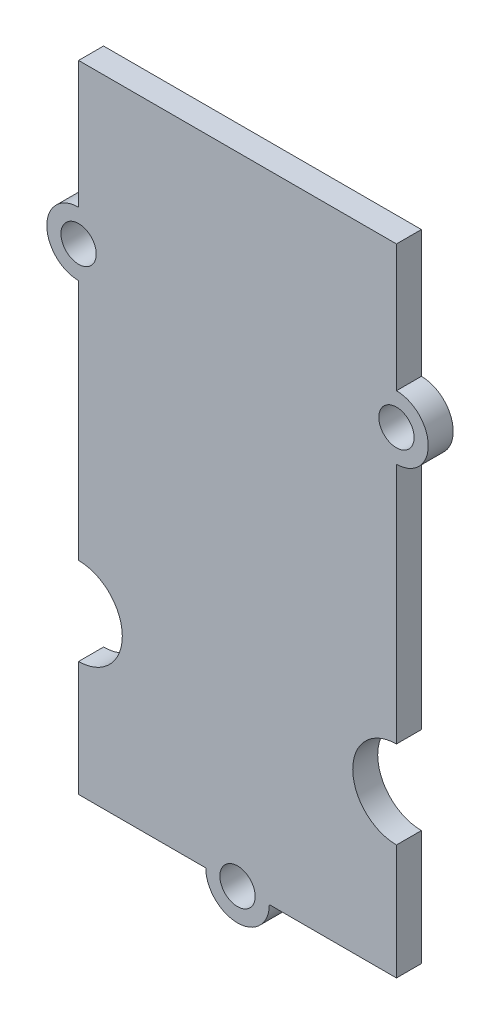
ISO-10303-21;
HEADER;
FILE_DESCRIPTION(('STEP AP214'),'2;1');
FILE_NAME('part.step','',(''),(''),'','','');
FILE_SCHEMA(('AUTOMOTIVE_DESIGN { 1 0 10303 214 1 1 1 1 }'));
ENDSEC;
DATA;
#1=APPLICATION_CONTEXT('core data for automotive mechanical design processes');
#2=APPLICATION_PROTOCOL_DEFINITION('international standard','automotive_design',2000,#1);
#3=PRODUCT_CONTEXT('',#1,'mechanical');
#4=PRODUCT('Part','Part','',(#3));
#5=PRODUCT_RELATED_PRODUCT_CATEGORY('part','',(#4));
#6=PRODUCT_DEFINITION_FORMATION('','',#4);
#7=PRODUCT_DEFINITION_CONTEXT('part definition',#1,'design');
#8=PRODUCT_DEFINITION('design','',#6,#7);
#9=PRODUCT_DEFINITION_SHAPE('','',#8);
#10=(LENGTH_UNIT() NAMED_UNIT(*) SI_UNIT(.MILLI.,.METRE.));
#11=(NAMED_UNIT(*) PLANE_ANGLE_UNIT() SI_UNIT($,.RADIAN.));
#12=(NAMED_UNIT(*) SI_UNIT($,.STERADIAN.) SOLID_ANGLE_UNIT());
#13=UNCERTAINTY_MEASURE_WITH_UNIT(LENGTH_MEASURE(1.E-05),#10,'distance_accuracy_value','');
#14=(GEOMETRIC_REPRESENTATION_CONTEXT(3) GLOBAL_UNCERTAINTY_ASSIGNED_CONTEXT((#13)) GLOBAL_UNIT_ASSIGNED_CONTEXT((#10,
#11,#12)) REPRESENTATION_CONTEXT('',''));
#15=CARTESIAN_POINT('',(0.,0.,0.));
#16=DIRECTION('',(0.,0.,1.));
#17=DIRECTION('',(1.,0.,0.));
#18=AXIS2_PLACEMENT_3D('',#15,#16,#17);
#19=CARTESIAN_POINT('',(0.,0.,0.));
#20=DIRECTION('',(0.,0.,1.));
#21=DIRECTION('',(1.,0.,0.));
#22=AXIS2_PLACEMENT_3D('',#19,#20,#21);
#23=PLANE('',#22);
#24=CARTESIAN_POINT('',(0.,30.,0.));
#25=DIRECTION('',(0.,0.,1.));
#26=DIRECTION('',(1.,0.,0.));
#27=AXIS2_PLACEMENT_3D('',#24,#25,#26);
#28=CIRCLE('',#27,1.11);
#29=CARTESIAN_POINT('',(1.11,30.,0.));
#30=VERTEX_POINT('',#29);
#31=EDGE_CURVE('E207',#30,#30,#28,.F.);
#32=ORIENTED_EDGE('',*,*,#31,.F.);
#33=EDGE_LOOP('',(#32));
#34=FACE_BOUND('',#33,.T.);
#35=CARTESIAN_POINT('',(10.,0.,0.));
#36=DIRECTION('',(0.,0.,1.));
#37=DIRECTION('',(1.,0.,0.));
#38=AXIS2_PLACEMENT_3D('',#35,#36,#37);
#39=CIRCLE('',#38,1.11);
#40=CARTESIAN_POINT('',(11.11,0.,0.));
#41=VERTEX_POINT('',#40);
#42=EDGE_CURVE('E298',#41,#41,#39,.F.);
#43=ORIENTED_EDGE('',*,*,#42,.F.);
#44=EDGE_LOOP('',(#43));
#45=FACE_BOUND('',#44,.T.);
#46=CARTESIAN_POINT('',(20.,30.,0.));
#47=DIRECTION('',(0.,0.,1.));
#48=DIRECTION('',(1.,0.,0.));
#49=AXIS2_PLACEMENT_3D('',#46,#47,#48);
#50=CIRCLE('',#49,1.11);
#51=CARTESIAN_POINT('',(21.11,30.,0.));
#52=VERTEX_POINT('',#51);
#53=EDGE_CURVE('E294',#52,#52,#50,.T.);
#54=ORIENTED_EDGE('',*,*,#53,.T.);
#55=EDGE_LOOP('',(#54));
#56=FACE_BOUND('',#55,.T.);
#57=CARTESIAN_POINT('',(20.,30.,0.));
#58=DIRECTION('',(0.,0.,1.));
#59=DIRECTION('',(1.,0.,0.));
#60=AXIS2_PLACEMENT_3D('',#57,#58,#59);
#61=CIRCLE('',#60,2.);
#62=CARTESIAN_POINT('',(20.,28.,0.));
#63=VERTEX_POINT('',#62);
#64=CARTESIAN_POINT('',(20.,32.,0.));
#65=VERTEX_POINT('',#64);
#66=EDGE_CURVE('E191',#63,#65,#61,.T.);
#67=ORIENTED_EDGE('',*,*,#66,.F.);
#68=DIRECTION('',(0.,1.,0.));
#69=VECTOR('',#68,1.);
#70=CARTESIAN_POINT('',(20.,0.,0.));
#71=LINE('',#70,#69);
#72=CARTESIAN_POINT('',(20.,12.75,0.));
#73=VERTEX_POINT('',#72);
#74=EDGE_CURVE('E260',#73,#63,#71,.T.);
#75=ORIENTED_EDGE('',*,*,#74,.F.);
#76=CARTESIAN_POINT('',(20.,10.,0.));
#77=DIRECTION('',(0.,0.,1.));
#78=DIRECTION('',(1.,0.,0.));
#79=AXIS2_PLACEMENT_3D('',#76,#77,#78);
#80=CIRCLE('',#79,2.75);
#81=CARTESIAN_POINT('',(20.,7.25,0.));
#82=VERTEX_POINT('',#81);
#83=EDGE_CURVE('E290',#73,#82,#80,.T.);
#84=ORIENTED_EDGE('',*,*,#83,.T.);
#85=CARTESIAN_POINT('',(20.,0.,0.));
#86=VERTEX_POINT('',#85);
#87=EDGE_CURVE('E261',#86,#82,#71,.T.);
#88=ORIENTED_EDGE('',*,*,#87,.F.);
#89=DIRECTION('',(1.,0.,0.));
#90=VECTOR('',#89,1.);
#91=CARTESIAN_POINT('',(0.,0.,0.));
#92=LINE('',#91,#90);
#93=CARTESIAN_POINT('',(12.,0.,0.));
#94=VERTEX_POINT('',#93);
#95=EDGE_CURVE('E287',#94,#86,#92,.T.);
#96=ORIENTED_EDGE('',*,*,#95,.F.);
#97=CARTESIAN_POINT('',(10.,0.,0.));
#98=DIRECTION('',(0.,0.,1.));
#99=DIRECTION('',(1.,0.,0.));
#100=AXIS2_PLACEMENT_3D('',#97,#98,#99);
#101=CIRCLE('',#100,2.);
#102=CARTESIAN_POINT('',(8.,0.,0.));
#103=VERTEX_POINT('',#102);
#104=EDGE_CURVE('E283',#94,#103,#101,.F.);
#105=ORIENTED_EDGE('',*,*,#104,.T.);
#106=DIRECTION('',(1.,0.,0.));
#107=VECTOR('',#106,1.);
#108=CARTESIAN_POINT('',(0.,0.,0.));
#109=LINE('',#108,#107);
#110=CARTESIAN_POINT('',(0.,0.,0.));
#111=VERTEX_POINT('',#110);
#112=EDGE_CURVE('E279',#111,#103,#109,.T.);
#113=ORIENTED_EDGE('',*,*,#112,.F.);
#114=DIRECTION('',(0.,1.,0.));
#115=VECTOR('',#114,1.);
#116=CARTESIAN_POINT('',(0.,0.,0.));
#117=LINE('',#116,#115);
#118=CARTESIAN_POINT('',(0.,7.25,0.));
#119=VERTEX_POINT('',#118);
#120=EDGE_CURVE('E270',#111,#119,#117,.T.);
#121=ORIENTED_EDGE('',*,*,#120,.T.);
#122=CARTESIAN_POINT('',(0.,10.,0.));
#123=DIRECTION('',(0.,0.,1.));
#124=DIRECTION('',(1.,0.,0.));
#125=AXIS2_PLACEMENT_3D('',#122,#123,#124);
#126=CIRCLE('',#125,2.75);
#127=CARTESIAN_POINT('',(0.,12.75,0.));
#128=VERTEX_POINT('',#127);
#129=EDGE_CURVE('E275',#128,#119,#126,.F.);
#130=ORIENTED_EDGE('',*,*,#129,.F.);
#131=CARTESIAN_POINT('',(0.,28.,0.));
#132=VERTEX_POINT('',#131);
#133=EDGE_CURVE('E271',#128,#132,#117,.T.);
#134=ORIENTED_EDGE('',*,*,#133,.T.);
#135=CARTESIAN_POINT('',(0.,30.,0.));
#136=DIRECTION('',(0.,0.,1.));
#137=DIRECTION('',(1.,0.,0.));
#138=AXIS2_PLACEMENT_3D('',#135,#136,#137);
#139=CIRCLE('',#138,2.);
#140=CARTESIAN_POINT('',(0.,32.,0.));
#141=VERTEX_POINT('',#140);
#142=EDGE_CURVE('E269',#132,#141,#139,.F.);
#143=ORIENTED_EDGE('',*,*,#142,.T.);
#144=CARTESIAN_POINT('',(0.,40.,0.));
#145=VERTEX_POINT('',#144);
#146=EDGE_CURVE('E265',#141,#145,#117,.T.);
#147=ORIENTED_EDGE('',*,*,#146,.T.);
#148=DIRECTION('',(1.,0.,0.));
#149=VECTOR('',#148,1.);
#150=CARTESIAN_POINT('',(0.,40.,0.));
#151=LINE('',#150,#149);
#152=CARTESIAN_POINT('',(20.,40.,0.));
#153=VERTEX_POINT('',#152);
#154=EDGE_CURVE('E259',#145,#153,#151,.T.);
#155=ORIENTED_EDGE('',*,*,#154,.T.);
#156=EDGE_CURVE('E196',#65,#153,#71,.T.);
#157=ORIENTED_EDGE('',*,*,#156,.F.);
#158=EDGE_LOOP('',(#67,#75,#84,#88,#96,#105,#113,#121,#130,#134,#143,#147,#155,#157));
#159=FACE_BOUND('',#158,.T.);
#160=DIRECTION('',(0.,1.,0.));
#161=VECTOR('',#160,1.);
#162=CARTESIAN_POINT('',(7.97952753923228,7.97952753923228,0.));
#163=LINE('',#162,#161);
#164=CARTESIAN_POINT('',(7.97952753923228,7.97952753923228,0.));
#165=VERTEX_POINT('',#164);
#166=CARTESIAN_POINT('',(7.97952753923228,12.0204724607677,0.));
#167=VERTEX_POINT('',#166);
#168=EDGE_CURVE('E189',#165,#167,#163,.T.);
#169=ORIENTED_EDGE('',*,*,#168,.F.);
#170=DIRECTION('',(-1.,0.,0.));
#171=VECTOR('',#170,1.);
#172=CARTESIAN_POINT('',(12.0204724607677,7.97952753923228,0.));
#173=LINE('',#172,#171);
#174=CARTESIAN_POINT('',(12.0204724607677,7.97952753923228,0.));
#175=VERTEX_POINT('',#174);
#176=EDGE_CURVE('E186',#175,#165,#173,.T.);
#177=ORIENTED_EDGE('',*,*,#176,.F.);
#178=DIRECTION('',(0.,-1.,0.));
#179=VECTOR('',#178,1.);
#180=CARTESIAN_POINT('',(12.0204724607677,7.97952753923228,0.));
#181=LINE('',#180,#179);
#182=CARTESIAN_POINT('',(12.0204724607677,12.0204724607677,0.));
#183=VERTEX_POINT('',#182);
#184=EDGE_CURVE('E62',#183,#175,#181,.T.);
#185=ORIENTED_EDGE('',*,*,#184,.F.);
#186=DIRECTION('',(1.,0.,0.));
#187=VECTOR('',#186,1.);
#188=CARTESIAN_POINT('',(12.0204724607677,12.0204724607677,0.));
#189=LINE('',#188,#187);
#190=EDGE_CURVE('E57',#167,#183,#189,.T.);
#191=ORIENTED_EDGE('',*,*,#190,.F.);
#192=EDGE_LOOP('',(#169,#177,#185,#191));
#193=FACE_BOUND('',#192,.T.);
#194=ADVANCED_FACE('F41',(#34,#45,#56,#159,#193),#23,.F.);
#195=CARTESIAN_POINT('',(20.,30.,1.57));
#196=DIRECTION('',(0.,0.,-1.));
#197=DIRECTION('',(-1.,0.,0.));
#198=AXIS2_PLACEMENT_3D('',#195,#196,#197);
#199=CYLINDRICAL_SURFACE('',#198,2.);
#200=ORIENTED_EDGE('',*,*,#66,.T.);
#201=DIRECTION('',(0.,0.,-1.));
#202=VECTOR('',#201,1.);
#203=CARTESIAN_POINT('',(20.,32.,1.57));
#204=LINE('',#203,#202);
#205=CARTESIAN_POINT('',(20.,32.,1.57));
#206=VERTEX_POINT('',#205);
#207=EDGE_CURVE('E11',#206,#65,#204,.T.);
#208=ORIENTED_EDGE('',*,*,#207,.F.);
#209=CARTESIAN_POINT('',(20.,30.,1.57));
#210=DIRECTION('',(0.,0.,1.));
#211=DIRECTION('',(1.,0.,0.));
#212=AXIS2_PLACEMENT_3D('',#209,#210,#211);
#213=CIRCLE('',#212,2.);
#214=CARTESIAN_POINT('',(20.,28.,1.57));
#215=VERTEX_POINT('',#214);
#216=EDGE_CURVE('E202',#215,#206,#213,.T.);
#217=ORIENTED_EDGE('',*,*,#216,.F.);
#218=DIRECTION('',(0.,0.,-1.));
#219=VECTOR('',#218,1.);
#220=CARTESIAN_POINT('',(20.,28.,1.57));
#221=LINE('',#220,#219);
#222=EDGE_CURVE('E254',#215,#63,#221,.T.);
#223=ORIENTED_EDGE('',*,*,#222,.T.);
#224=EDGE_LOOP('',(#200,#208,#217,#223));
#225=FACE_BOUND('',#224,.T.);
#226=ADVANCED_FACE('F43',(#225),#199,.T.);
#227=CARTESIAN_POINT('',(20.,0.,1.57));
#228=DIRECTION('',(-1.,0.,0.));
#229=DIRECTION('',(0.,0.,1.));
#230=AXIS2_PLACEMENT_3D('',#227,#228,#229);
#231=PLANE('',#230);
#232=ORIENTED_EDGE('',*,*,#156,.T.);
#233=DIRECTION('',(0.,0.,-1.));
#234=VECTOR('',#233,1.);
#235=CARTESIAN_POINT('',(20.,40.,1.57));
#236=LINE('',#235,#234);
#237=CARTESIAN_POINT('',(20.,40.,1.57));
#238=VERTEX_POINT('',#237);
#239=EDGE_CURVE('E50',#238,#153,#236,.T.);
#240=ORIENTED_EDGE('',*,*,#239,.F.);
#241=DIRECTION('',(0.,1.,0.));
#242=VECTOR('',#241,1.);
#243=CARTESIAN_POINT('',(20.,0.,1.57));
#244=LINE('',#243,#242);
#245=EDGE_CURVE('E206',#206,#238,#244,.T.);
#246=ORIENTED_EDGE('',*,*,#245,.F.);
#247=ORIENTED_EDGE('',*,*,#207,.T.);
#248=EDGE_LOOP('',(#232,#240,#246,#247));
#249=FACE_BOUND('',#248,.T.);
#250=ADVANCED_FACE('F348',(#249),#231,.F.);
#251=CARTESIAN_POINT('',(0.,40.,1.57));
#252=DIRECTION('',(0.,1.,0.));
#253=DIRECTION('',(0.,0.,1.));
#254=AXIS2_PLACEMENT_3D('',#251,#252,#253);
#255=PLANE('',#254);
#256=ORIENTED_EDGE('',*,*,#154,.F.);
#257=DIRECTION('',(0.,0.,-1.));
#258=VECTOR('',#257,1.);
#259=CARTESIAN_POINT('',(0.,40.,1.57));
#260=LINE('',#259,#258);
#261=CARTESIAN_POINT('',(0.,40.,1.57));
#262=VERTEX_POINT('',#261);
#263=EDGE_CURVE('E339',#262,#145,#260,.T.);
#264=ORIENTED_EDGE('',*,*,#263,.F.);
#265=DIRECTION('',(1.,0.,0.));
#266=VECTOR('',#265,1.);
#267=CARTESIAN_POINT('',(0.,40.,1.57));
#268=LINE('',#267,#266);
#269=EDGE_CURVE('E210',#262,#238,#268,.T.);
#270=ORIENTED_EDGE('',*,*,#269,.T.);
#271=ORIENTED_EDGE('',*,*,#239,.T.);
#272=EDGE_LOOP('',(#256,#264,#270,#271));
#273=FACE_BOUND('',#272,.T.);
#274=ADVANCED_FACE('F345',(#273),#255,.T.);
#275=CARTESIAN_POINT('',(0.,0.,1.57));
#276=DIRECTION('',(-1.,0.,0.));
#277=DIRECTION('',(0.,0.,1.));
#278=AXIS2_PLACEMENT_3D('',#275,#276,#277);
#279=PLANE('',#278);
#280=ORIENTED_EDGE('',*,*,#146,.F.);
#281=DIRECTION('',(0.,0.,-1.));
#282=VECTOR('',#281,1.);
#283=CARTESIAN_POINT('',(0.,32.,1.57));
#284=LINE('',#283,#282);
#285=CARTESIAN_POINT('',(0.,32.,1.57));
#286=VERTEX_POINT('',#285);
#287=EDGE_CURVE('E336',#286,#141,#284,.T.);
#288=ORIENTED_EDGE('',*,*,#287,.F.);
#289=DIRECTION('',(0.,1.,0.));
#290=VECTOR('',#289,1.);
#291=CARTESIAN_POINT('',(0.,0.,1.57));
#292=LINE('',#291,#290);
#293=EDGE_CURVE('E216',#286,#262,#292,.T.);
#294=ORIENTED_EDGE('',*,*,#293,.T.);
#295=ORIENTED_EDGE('',*,*,#263,.T.);
#296=EDGE_LOOP('',(#280,#288,#294,#295));
#297=FACE_BOUND('',#296,.T.);
#298=ADVANCED_FACE('F356',(#297),#279,.T.);
#299=CARTESIAN_POINT('',(0.,30.,1.57));
#300=DIRECTION('',(0.,0.,-1.));
#301=DIRECTION('',(-1.,0.,0.));
#302=AXIS2_PLACEMENT_3D('',#299,#300,#301);
#303=CYLINDRICAL_SURFACE('',#302,2.);
#304=ORIENTED_EDGE('',*,*,#142,.F.);
#305=DIRECTION('',(0.,0.,-1.));
#306=VECTOR('',#305,1.);
#307=CARTESIAN_POINT('',(0.,28.,1.57));
#308=LINE('',#307,#306);
#309=CARTESIAN_POINT('',(0.,28.,1.57));
#310=VERTEX_POINT('',#309);
#311=EDGE_CURVE('E333',#310,#132,#308,.T.);
#312=ORIENTED_EDGE('',*,*,#311,.F.);
#313=CARTESIAN_POINT('',(0.,30.,1.57));
#314=DIRECTION('',(0.,0.,1.));
#315=DIRECTION('',(1.,0.,0.));
#316=AXIS2_PLACEMENT_3D('',#313,#314,#315);
#317=CIRCLE('',#316,2.);
#318=EDGE_CURVE('E220',#310,#286,#317,.F.);
#319=ORIENTED_EDGE('',*,*,#318,.T.);
#320=ORIENTED_EDGE('',*,*,#287,.T.);
#321=EDGE_LOOP('',(#304,#312,#319,#320));
#322=FACE_BOUND('',#321,.T.);
#323=ADVANCED_FACE('F393',(#322),#303,.T.);
#324=ORIENTED_EDGE('',*,*,#133,.F.);
#325=DIRECTION('',(0.,0.,-1.));
#326=VECTOR('',#325,1.);
#327=CARTESIAN_POINT('',(0.,12.75,1.57));
#328=LINE('',#327,#326);
#329=CARTESIAN_POINT('',(0.,12.75,1.57));
#330=VERTEX_POINT('',#329);
#331=EDGE_CURVE('E330',#330,#128,#328,.T.);
#332=ORIENTED_EDGE('',*,*,#331,.F.);
#333=EDGE_CURVE('E222',#330,#310,#292,.T.);
#334=ORIENTED_EDGE('',*,*,#333,.T.);
#335=ORIENTED_EDGE('',*,*,#311,.T.);
#336=EDGE_LOOP('',(#324,#332,#334,#335));
#337=FACE_BOUND('',#336,.T.);
#338=ADVANCED_FACE('F388',(#337),#279,.T.);
#339=CARTESIAN_POINT('',(0.,10.,1.57));
#340=DIRECTION('',(0.,0.,-1.));
#341=DIRECTION('',(-1.,0.,0.));
#342=AXIS2_PLACEMENT_3D('',#339,#340,#341);
#343=CYLINDRICAL_SURFACE('',#342,2.75);
#344=ORIENTED_EDGE('',*,*,#129,.T.);
#345=DIRECTION('',(0.,0.,-1.));
#346=VECTOR('',#345,1.);
#347=CARTESIAN_POINT('',(0.,7.25,1.57));
#348=LINE('',#347,#346);
#349=CARTESIAN_POINT('',(0.,7.25,1.57));
#350=VERTEX_POINT('',#349);
#351=EDGE_CURVE('E327',#350,#119,#348,.T.);
#352=ORIENTED_EDGE('',*,*,#351,.F.);
#353=CARTESIAN_POINT('',(0.,10.,1.57));
#354=DIRECTION('',(0.,0.,1.));
#355=DIRECTION('',(1.,0.,0.));
#356=AXIS2_PLACEMENT_3D('',#353,#354,#355);
#357=CIRCLE('',#356,2.75);
#358=EDGE_CURVE('E226',#330,#350,#357,.F.);
#359=ORIENTED_EDGE('',*,*,#358,.F.);
#360=ORIENTED_EDGE('',*,*,#331,.T.);
#361=EDGE_LOOP('',(#344,#352,#359,#360));
#362=FACE_BOUND('',#361,.T.);
#363=ADVANCED_FACE('F629',(#362),#343,.F.);
#364=ORIENTED_EDGE('',*,*,#120,.F.);
#365=DIRECTION('',(0.,0.,-1.));
#366=VECTOR('',#365,1.);
#367=CARTESIAN_POINT('',(0.,0.,1.57));
#368=LINE('',#367,#366);
#369=CARTESIAN_POINT('',(0.,0.,1.57));
#370=VERTEX_POINT('',#369);
#371=EDGE_CURVE('E324',#370,#111,#368,.T.);
#372=ORIENTED_EDGE('',*,*,#371,.F.);
#373=EDGE_CURVE('E221',#370,#350,#292,.T.);
#374=ORIENTED_EDGE('',*,*,#373,.T.);
#375=ORIENTED_EDGE('',*,*,#351,.T.);
#376=EDGE_LOOP('',(#364,#372,#374,#375));
#377=FACE_BOUND('',#376,.T.);
#378=ADVANCED_FACE('F401',(#377),#279,.T.);
#379=CARTESIAN_POINT('',(0.,0.,1.57));
#380=DIRECTION('',(0.,1.,0.));
#381=DIRECTION('',(0.,0.,1.));
#382=AXIS2_PLACEMENT_3D('',#379,#380,#381);
#383=PLANE('',#382);
#384=ORIENTED_EDGE('',*,*,#112,.T.);
#385=DIRECTION('',(0.,0.,-1.));
#386=VECTOR('',#385,1.);
#387=CARTESIAN_POINT('',(8.,0.,1.57));
#388=LINE('',#387,#386);
#389=CARTESIAN_POINT('',(8.,0.,1.57));
#390=VERTEX_POINT('',#389);
#391=EDGE_CURVE('E321',#390,#103,#388,.T.);
#392=ORIENTED_EDGE('',*,*,#391,.F.);
#393=DIRECTION('',(1.,0.,0.));
#394=VECTOR('',#393,1.);
#395=CARTESIAN_POINT('',(0.,0.,1.57));
#396=LINE('',#395,#394);
#397=EDGE_CURVE('E229',#370,#390,#396,.T.);
#398=ORIENTED_EDGE('',*,*,#397,.F.);
#399=ORIENTED_EDGE('',*,*,#371,.T.);
#400=EDGE_LOOP('',(#384,#392,#398,#399));
#401=FACE_BOUND('',#400,.T.);
#402=ADVANCED_FACE('F406',(#401),#383,.F.);
#403=CARTESIAN_POINT('',(10.,0.,1.57));
#404=DIRECTION('',(0.,0.,-1.));
#405=DIRECTION('',(-1.,0.,0.));
#406=AXIS2_PLACEMENT_3D('',#403,#404,#405);
#407=CYLINDRICAL_SURFACE('',#406,2.);
#408=ORIENTED_EDGE('',*,*,#104,.F.);
#409=DIRECTION('',(0.,0.,-1.));
#410=VECTOR('',#409,1.);
#411=CARTESIAN_POINT('',(12.,0.,1.57));
#412=LINE('',#411,#410);
#413=CARTESIAN_POINT('',(12.,0.,1.57));
#414=VERTEX_POINT('',#413);
#415=EDGE_CURVE('E318',#414,#94,#412,.T.);
#416=ORIENTED_EDGE('',*,*,#415,.F.);
#417=CARTESIAN_POINT('',(10.,0.,1.57));
#418=DIRECTION('',(0.,0.,1.));
#419=DIRECTION('',(1.,0.,0.));
#420=AXIS2_PLACEMENT_3D('',#417,#418,#419);
#421=CIRCLE('',#420,2.);
#422=EDGE_CURVE('E232',#414,#390,#421,.F.);
#423=ORIENTED_EDGE('',*,*,#422,.T.);
#424=ORIENTED_EDGE('',*,*,#391,.T.);
#425=EDGE_LOOP('',(#408,#416,#423,#424));
#426=FACE_BOUND('',#425,.T.);
#427=ADVANCED_FACE('F410',(#426),#407,.T.);
#428=CARTESIAN_POINT('',(0.,0.,1.57));
#429=DIRECTION('',(0.,1.,0.));
#430=DIRECTION('',(0.,0.,1.));
#431=AXIS2_PLACEMENT_3D('',#428,#429,#430);
#432=PLANE('',#431);
#433=ORIENTED_EDGE('',*,*,#95,.T.);
#434=DIRECTION('',(0.,0.,-1.));
#435=VECTOR('',#434,1.);
#436=CARTESIAN_POINT('',(20.,0.,1.57));
#437=LINE('',#436,#435);
#438=CARTESIAN_POINT('',(20.,0.,1.57));
#439=VERTEX_POINT('',#438);
#440=EDGE_CURVE('E314',#439,#86,#437,.T.);
#441=ORIENTED_EDGE('',*,*,#440,.F.);
#442=DIRECTION('',(1.,0.,0.));
#443=VECTOR('',#442,1.);
#444=CARTESIAN_POINT('',(0.,0.,1.57));
#445=LINE('',#444,#443);
#446=EDGE_CURVE('E236',#414,#439,#445,.T.);
#447=ORIENTED_EDGE('',*,*,#446,.F.);
#448=ORIENTED_EDGE('',*,*,#415,.T.);
#449=EDGE_LOOP('',(#433,#441,#447,#448));
#450=FACE_BOUND('',#449,.T.);
#451=ADVANCED_FACE('F413',(#450),#432,.F.);
#452=ORIENTED_EDGE('',*,*,#87,.T.);
#453=DIRECTION('',(0.,0.,-1.));
#454=VECTOR('',#453,1.);
#455=CARTESIAN_POINT('',(20.,7.25,1.57));
#456=LINE('',#455,#454);
#457=CARTESIAN_POINT('',(20.,7.25,1.57));
#458=VERTEX_POINT('',#457);
#459=EDGE_CURVE('E311',#458,#82,#456,.T.);
#460=ORIENTED_EDGE('',*,*,#459,.F.);
#461=EDGE_CURVE('E212',#439,#458,#244,.T.);
#462=ORIENTED_EDGE('',*,*,#461,.F.);
#463=ORIENTED_EDGE('',*,*,#440,.T.);
#464=EDGE_LOOP('',(#452,#460,#462,#463));
#465=FACE_BOUND('',#464,.T.);
#466=ADVANCED_FACE('F378',(#465),#231,.F.);
#467=CARTESIAN_POINT('',(20.,10.,1.57));
#468=DIRECTION('',(0.,0.,-1.));
#469=DIRECTION('',(-1.,0.,0.));
#470=AXIS2_PLACEMENT_3D('',#467,#468,#469);
#471=CYLINDRICAL_SURFACE('',#470,2.75);
#472=ORIENTED_EDGE('',*,*,#83,.F.);
#473=DIRECTION('',(0.,0.,-1.));
#474=VECTOR('',#473,1.);
#475=CARTESIAN_POINT('',(20.,12.75,1.57));
#476=LINE('',#475,#474);
#477=CARTESIAN_POINT('',(20.,12.75,1.57));
#478=VERTEX_POINT('',#477);
#479=EDGE_CURVE('E308',#478,#73,#476,.T.);
#480=ORIENTED_EDGE('',*,*,#479,.F.);
#481=CARTESIAN_POINT('',(20.,10.,1.57));
#482=DIRECTION('',(0.,0.,1.));
#483=DIRECTION('',(1.,0.,0.));
#484=AXIS2_PLACEMENT_3D('',#481,#482,#483);
#485=CIRCLE('',#484,2.75);
#486=EDGE_CURVE('E239',#478,#458,#485,.T.);
#487=ORIENTED_EDGE('',*,*,#486,.T.);
#488=ORIENTED_EDGE('',*,*,#459,.T.);
#489=EDGE_LOOP('',(#472,#480,#487,#488));
#490=FACE_BOUND('',#489,.T.);
#491=ADVANCED_FACE('F373',(#490),#471,.F.);
#492=CARTESIAN_POINT('',(10.,0.,1.57));
#493=DIRECTION('',(0.,0.,-1.));
#494=DIRECTION('',(-1.,0.,0.));
#495=AXIS2_PLACEMENT_3D('',#492,#493,#494);
#496=CYLINDRICAL_SURFACE('',#495,1.11);
#497=CARTESIAN_POINT('',(10.,0.,1.57));
#498=DIRECTION('',(0.,0.,1.));
#499=DIRECTION('',(1.,0.,0.));
#500=AXIS2_PLACEMENT_3D('',#497,#498,#499);
#501=CIRCLE('',#500,1.11);
#502=CARTESIAN_POINT('',(11.11,0.,1.57));
#503=VERTEX_POINT('',#502);
#504=EDGE_CURVE('E247',#503,#503,#501,.F.);
#505=ORIENTED_EDGE('',*,*,#504,.F.);
#506=EDGE_LOOP('',(#505));
#507=FACE_BOUND('',#506,.T.);
#508=ORIENTED_EDGE('',*,*,#42,.T.);
#509=EDGE_LOOP('',(#508));
#510=FACE_BOUND('',#509,.T.);
#511=ADVANCED_FACE('F443',(#507,#510),#496,.F.);
#512=CARTESIAN_POINT('',(20.,30.,1.57));
#513=DIRECTION('',(0.,0.,-1.));
#514=DIRECTION('',(-1.,0.,0.));
#515=AXIS2_PLACEMENT_3D('',#512,#513,#514);
#516=CYLINDRICAL_SURFACE('',#515,1.11);
#517=CARTESIAN_POINT('',(20.,30.,1.57));
#518=DIRECTION('',(0.,0.,1.));
#519=DIRECTION('',(1.,0.,0.));
#520=AXIS2_PLACEMENT_3D('',#517,#518,#519);
#521=CIRCLE('',#520,1.11);
#522=CARTESIAN_POINT('',(21.11,30.,1.57));
#523=VERTEX_POINT('',#522);
#524=EDGE_CURVE('E243',#523,#523,#521,.T.);
#525=ORIENTED_EDGE('',*,*,#524,.T.);
#526=EDGE_LOOP('',(#525));
#527=FACE_BOUND('',#526,.T.);
#528=ORIENTED_EDGE('',*,*,#53,.F.);
#529=EDGE_LOOP('',(#528));
#530=FACE_BOUND('',#529,.T.);
#531=ADVANCED_FACE('F446',(#527,#530),#516,.F.);
#532=ORIENTED_EDGE('',*,*,#74,.T.);
#533=ORIENTED_EDGE('',*,*,#222,.F.);
#534=EDGE_CURVE('E211',#478,#215,#244,.T.);
#535=ORIENTED_EDGE('',*,*,#534,.F.);
#536=ORIENTED_EDGE('',*,*,#479,.T.);
#537=EDGE_LOOP('',(#532,#533,#535,#536));
#538=FACE_BOUND('',#537,.T.);
#539=ADVANCED_FACE('F423',(#538),#231,.F.);
#540=CARTESIAN_POINT('',(0.,30.,1.57));
#541=DIRECTION('',(0.,0.,-1.));
#542=DIRECTION('',(-1.,0.,0.));
#543=AXIS2_PLACEMENT_3D('',#540,#541,#542);
#544=CYLINDRICAL_SURFACE('',#543,1.11);
#545=CARTESIAN_POINT('',(0.,30.,1.57));
#546=DIRECTION('',(0.,0.,1.));
#547=DIRECTION('',(1.,0.,0.));
#548=AXIS2_PLACEMENT_3D('',#545,#546,#547);
#549=CIRCLE('',#548,1.11);
#550=CARTESIAN_POINT('',(1.11,30.,1.57));
#551=VERTEX_POINT('',#550);
#552=EDGE_CURVE('E251',#551,#551,#549,.F.);
#553=ORIENTED_EDGE('',*,*,#552,.F.);
#554=EDGE_LOOP('',(#553));
#555=FACE_BOUND('',#554,.T.);
#556=ORIENTED_EDGE('',*,*,#31,.T.);
#557=EDGE_LOOP('',(#556));
#558=FACE_BOUND('',#557,.T.);
#559=ADVANCED_FACE('F439',(#555,#558),#544,.F.);
#560=CARTESIAN_POINT('',(0.,0.,1.57));
#561=DIRECTION('',(0.,0.,1.));
#562=DIRECTION('',(1.,0.,0.));
#563=AXIS2_PLACEMENT_3D('',#560,#561,#562);
#564=PLANE('',#563);
#565=ORIENTED_EDGE('',*,*,#216,.T.);
#566=ORIENTED_EDGE('',*,*,#245,.T.);
#567=ORIENTED_EDGE('',*,*,#269,.F.);
#568=ORIENTED_EDGE('',*,*,#293,.F.);
#569=ORIENTED_EDGE('',*,*,#318,.F.);
#570=ORIENTED_EDGE('',*,*,#333,.F.);
#571=ORIENTED_EDGE('',*,*,#358,.T.);
#572=ORIENTED_EDGE('',*,*,#373,.F.);
#573=ORIENTED_EDGE('',*,*,#397,.T.);
#574=ORIENTED_EDGE('',*,*,#422,.F.);
#575=ORIENTED_EDGE('',*,*,#446,.T.);
#576=ORIENTED_EDGE('',*,*,#461,.T.);
#577=ORIENTED_EDGE('',*,*,#486,.F.);
#578=ORIENTED_EDGE('',*,*,#534,.T.);
#579=EDGE_LOOP('',(#565,#566,#567,#568,#569,#570,#571,#572,#573,#574,#575,#576,#577,#578));
#580=FACE_BOUND('',#579,.T.);
#581=ORIENTED_EDGE('',*,*,#524,.F.);
#582=EDGE_LOOP('',(#581));
#583=FACE_BOUND('',#582,.T.);
#584=ORIENTED_EDGE('',*,*,#504,.T.);
#585=EDGE_LOOP('',(#584));
#586=FACE_BOUND('',#585,.T.);
#587=ORIENTED_EDGE('',*,*,#552,.T.);
#588=EDGE_LOOP('',(#587));
#589=FACE_BOUND('',#588,.T.);
#590=ADVANCED_FACE('F359',(#580,#583,#586,#589),#564,.T.);
#591=CARTESIAN_POINT('',(7.97952753923228,7.97952753923228,-1.57));
#592=DIRECTION('',(1.,0.,0.));
#593=DIRECTION('',(0.,0.,-1.));
#594=AXIS2_PLACEMENT_3D('',#591,#592,#593);
#595=PLANE('',#594);
#596=ORIENTED_EDGE('',*,*,#168,.T.);
#597=DIRECTION('',(0.,0.,1.));
#598=VECTOR('',#597,1.);
#599=CARTESIAN_POINT('',(7.97952753923228,12.0204724607677,-1.57));
#600=LINE('',#599,#598);
#601=CARTESIAN_POINT('',(7.97952753923228,12.0204724607677,-1.57));
#602=VERTEX_POINT('',#601);
#603=EDGE_CURVE('E168',#602,#167,#600,.T.);
#604=ORIENTED_EDGE('',*,*,#603,.F.);
#605=DIRECTION('',(0.,1.,0.));
#606=VECTOR('',#605,1.);
#607=CARTESIAN_POINT('',(7.97952753923228,7.97952753923228,-1.57));
#608=LINE('',#607,#606);
#609=CARTESIAN_POINT('',(7.97952753923228,7.97952753923228,-1.57));
#610=VERTEX_POINT('',#609);
#611=EDGE_CURVE('E176',#610,#602,#608,.T.);
#612=ORIENTED_EDGE('',*,*,#611,.F.);
#613=DIRECTION('',(0.,0.,1.));
#614=VECTOR('',#613,1.);
#615=CARTESIAN_POINT('',(7.97952753923228,7.97952753923228,-1.57));
#616=LINE('',#615,#614);
#617=EDGE_CURVE('E550',#610,#165,#616,.T.);
#618=ORIENTED_EDGE('',*,*,#617,.T.);
#619=EDGE_LOOP('',(#596,#604,#612,#618));
#620=FACE_BOUND('',#619,.T.);
#621=ADVANCED_FACE('F188',(#620),#595,.F.);
#622=CARTESIAN_POINT('',(12.0204724607677,12.0204724607677,-1.57));
#623=DIRECTION('',(0.,-1.,0.));
#624=DIRECTION('',(0.,0.,-1.));
#625=AXIS2_PLACEMENT_3D('',#622,#623,#624);
#626=PLANE('',#625);
#627=ORIENTED_EDGE('',*,*,#190,.T.);
#628=DIRECTION('',(0.,0.,1.));
#629=VECTOR('',#628,1.);
#630=CARTESIAN_POINT('',(12.0204724607677,12.0204724607677,-1.57));
#631=LINE('',#630,#629);
#632=CARTESIAN_POINT('',(12.0204724607677,12.0204724607677,-1.57));
#633=VERTEX_POINT('',#632);
#634=EDGE_CURVE('E171',#633,#183,#631,.T.);
#635=ORIENTED_EDGE('',*,*,#634,.F.);
#636=DIRECTION('',(1.,0.,0.));
#637=VECTOR('',#636,1.);
#638=CARTESIAN_POINT('',(12.0204724607677,12.0204724607677,-1.57));
#639=LINE('',#638,#637);
#640=EDGE_CURVE('E164',#602,#633,#639,.T.);
#641=ORIENTED_EDGE('',*,*,#640,.F.);
#642=ORIENTED_EDGE('',*,*,#603,.T.);
#643=EDGE_LOOP('',(#627,#635,#641,#642));
#644=FACE_BOUND('',#643,.T.);
#645=ADVANCED_FACE('F166',(#644),#626,.F.);
#646=CARTESIAN_POINT('',(12.0204724607677,7.97952753923228,-1.57));
#647=DIRECTION('',(-1.,0.,0.));
#648=DIRECTION('',(0.,0.,1.));
#649=AXIS2_PLACEMENT_3D('',#646,#647,#648);
#650=PLANE('',#649);
#651=ORIENTED_EDGE('',*,*,#184,.T.);
#652=DIRECTION('',(0.,0.,1.));
#653=VECTOR('',#652,1.);
#654=CARTESIAN_POINT('',(12.0204724607677,7.97952753923228,-1.57));
#655=LINE('',#654,#653);
#656=CARTESIAN_POINT('',(12.0204724607677,7.97952753923228,-1.57));
#657=VERTEX_POINT('',#656);
#658=EDGE_CURVE('E198',#657,#175,#655,.T.);
#659=ORIENTED_EDGE('',*,*,#658,.F.);
#660=DIRECTION('',(0.,-1.,0.));
#661=VECTOR('',#660,1.);
#662=CARTESIAN_POINT('',(12.0204724607677,7.97952753923228,-1.57));
#663=LINE('',#662,#661);
#664=EDGE_CURVE('E175',#633,#657,#663,.T.);
#665=ORIENTED_EDGE('',*,*,#664,.F.);
#666=ORIENTED_EDGE('',*,*,#634,.T.);
#667=EDGE_LOOP('',(#651,#659,#665,#666));
#668=FACE_BOUND('',#667,.T.);
#669=ADVANCED_FACE('F492',(#668),#650,.F.);
#670=CARTESIAN_POINT('',(12.0204724607677,7.97952753923228,-1.57));
#671=DIRECTION('',(0.,1.,0.));
#672=DIRECTION('',(0.,0.,1.));
#673=AXIS2_PLACEMENT_3D('',#670,#671,#672);
#674=PLANE('',#673);
#675=ORIENTED_EDGE('',*,*,#176,.T.);
#676=ORIENTED_EDGE('',*,*,#617,.F.);
#677=DIRECTION('',(-1.,0.,0.));
#678=VECTOR('',#677,1.);
#679=CARTESIAN_POINT('',(12.0204724607677,7.97952753923228,-1.57));
#680=LINE('',#679,#678);
#681=EDGE_CURVE('E181',#657,#610,#680,.T.);
#682=ORIENTED_EDGE('',*,*,#681,.F.);
#683=ORIENTED_EDGE('',*,*,#658,.T.);
#684=EDGE_LOOP('',(#675,#676,#682,#683));
#685=FACE_BOUND('',#684,.T.);
#686=ADVANCED_FACE('F499',(#685),#674,.F.);
#687=CARTESIAN_POINT('',(0.,0.,-1.57));
#688=DIRECTION('',(0.,0.,1.));
#689=DIRECTION('',(1.,0.,0.));
#690=AXIS2_PLACEMENT_3D('',#687,#688,#689);
#691=PLANE('',#690);
#692=ORIENTED_EDGE('',*,*,#611,.T.);
#693=ORIENTED_EDGE('',*,*,#640,.T.);
#694=ORIENTED_EDGE('',*,*,#664,.T.);
#695=ORIENTED_EDGE('',*,*,#681,.T.);
#696=EDGE_LOOP('',(#692,#693,#694,#695));
#697=FACE_BOUND('',#696,.T.);
#698=ADVANCED_FACE('F179',(#697),#691,.F.);
#699=CLOSED_SHELL('',(#194,#226,#250,#274,#298,#323,#338,#363,#378,#402,#427,#451,#466,#491,
#511,#531,#539,#559,#590,#621,#645,#669,#686,#698));
#700=MANIFOLD_SOLID_BREP('B2',#699);
#701=ADVANCED_BREP_SHAPE_REPRESENTATION('',(#18,#700),#14);
#702=SHAPE_DEFINITION_REPRESENTATION(#9,#701);
ENDSEC;
END-ISO-10303-21;
